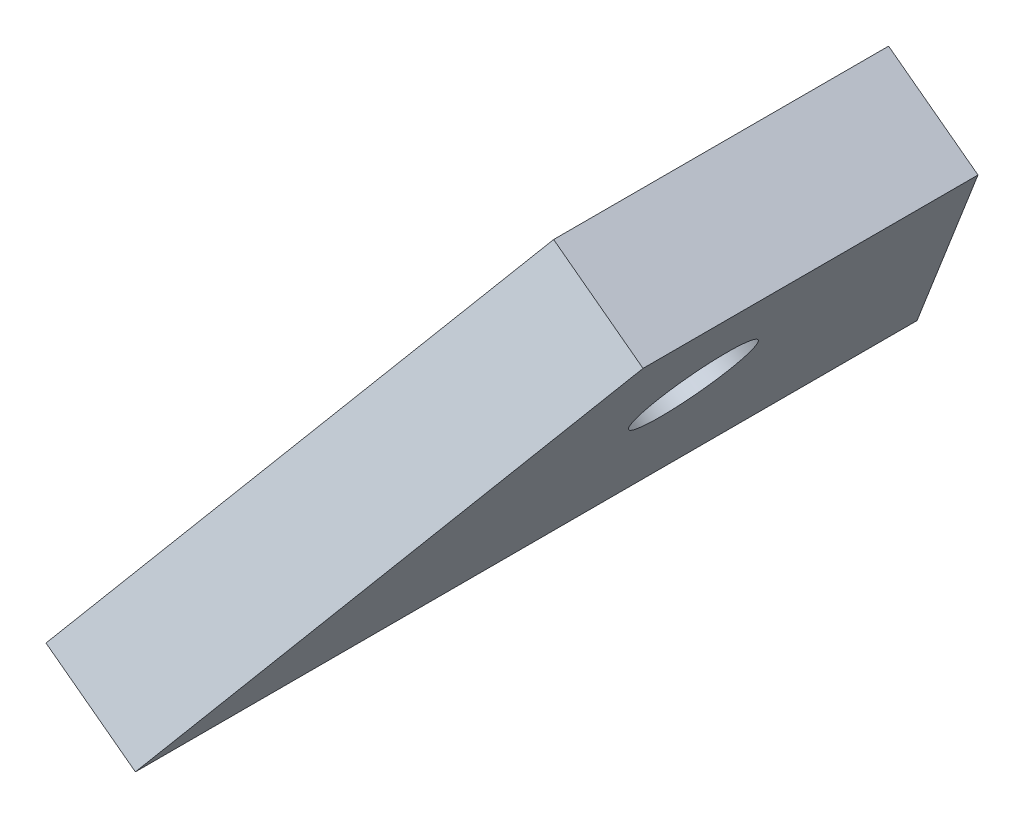
ISO-10303-21;
HEADER;
FILE_DESCRIPTION(('STEP AP214'),'2;1');
FILE_NAME('part.step','',(''),(''),'','','');
FILE_SCHEMA(('AUTOMOTIVE_DESIGN { 1 0 10303 214 1 1 1 1 }'));
ENDSEC;
DATA;
#1=APPLICATION_CONTEXT('core data for automotive mechanical design processes');
#2=APPLICATION_PROTOCOL_DEFINITION('international standard','automotive_design',2000,#1);
#3=PRODUCT_CONTEXT('',#1,'mechanical');
#4=PRODUCT('Part','Part','',(#3));
#5=PRODUCT_RELATED_PRODUCT_CATEGORY('part','',(#4));
#6=PRODUCT_DEFINITION_FORMATION('','',#4);
#7=PRODUCT_DEFINITION_CONTEXT('part definition',#1,'design');
#8=PRODUCT_DEFINITION('design','',#6,#7);
#9=PRODUCT_DEFINITION_SHAPE('','',#8);
#10=(LENGTH_UNIT() NAMED_UNIT(*) SI_UNIT(.MILLI.,.METRE.));
#11=(NAMED_UNIT(*) PLANE_ANGLE_UNIT() SI_UNIT($,.RADIAN.));
#12=(NAMED_UNIT(*) SI_UNIT($,.STERADIAN.) SOLID_ANGLE_UNIT());
#13=UNCERTAINTY_MEASURE_WITH_UNIT(LENGTH_MEASURE(1.E-05),#10,'distance_accuracy_value','');
#14=(GEOMETRIC_REPRESENTATION_CONTEXT(3) GLOBAL_UNCERTAINTY_ASSIGNED_CONTEXT((#13)) GLOBAL_UNIT_ASSIGNED_CONTEXT((#10,
#11,#12)) REPRESENTATION_CONTEXT('',''));
#15=CARTESIAN_POINT('',(0.,0.,0.));
#16=DIRECTION('',(0.,0.,1.));
#17=DIRECTION('',(1.,0.,0.));
#18=AXIS2_PLACEMENT_3D('',#15,#16,#17);
#19=CARTESIAN_POINT('',(-189.838837280634,417.784939326968,-6.));
#20=DIRECTION('',(-0.255106348102914,-0.340916217427251,0.904818702200994));
#21=DIRECTION('',(0.,-0.935780883525478,-0.35258210111728));
#22=AXIS2_PLACEMENT_3D('',#19,#20,#21);
#23=PLANE('',#22);
#24=DIRECTION('',(-0.542100989718691,-0.724446962032905,-0.425797036329881));
#25=VECTOR('',#24,1.);
#26=CARTESIAN_POINT('',(-186.636220180565,415.388432763166,-6.));
#27=LINE('',#26,#25);
#28=CARTESIAN_POINT('',(-186.636220180565,415.388432763166,-6.));
#29=VERTEX_POINT('',#28);
#30=CARTESIAN_POINT('',(-196.82137307672,401.777310087871,-14.));
#31=VERTEX_POINT('',#30);
#32=EDGE_CURVE('E106',#29,#31,#27,.T.);
#33=ORIENTED_EDGE('',*,*,#32,.T.);
#34=DIRECTION('',(0.800654275017383,-0.599126640950299,0.));
#35=VECTOR('',#34,1.);
#36=CARTESIAN_POINT('',(-200.02399017679,404.173816651672,-14.));
#37=LINE('',#36,#35);
#38=CARTESIAN_POINT('',(-200.02399017679,404.173816651672,-14.));
#39=VERTEX_POINT('',#38);
#40=EDGE_CURVE('E12',#39,#31,#37,.T.);
#41=ORIENTED_EDGE('',*,*,#40,.F.);
#42=DIRECTION('',(-0.542100989718691,-0.724446962032905,-0.425797036329881));
#43=VECTOR('',#42,1.);
#44=CARTESIAN_POINT('',(-189.838837280634,417.784939326968,-6.));
#45=LINE('',#44,#43);
#46=CARTESIAN_POINT('',(-189.838837280634,417.784939326968,-6.));
#47=VERTEX_POINT('',#46);
#48=EDGE_CURVE('E93',#47,#39,#45,.T.);
#49=ORIENTED_EDGE('',*,*,#48,.F.);
#50=DIRECTION('',(0.800654275017383,-0.599126640950299,0.));
#51=VECTOR('',#50,1.);
#52=CARTESIAN_POINT('',(-189.838837280634,417.784939326968,-6.));
#53=LINE('',#52,#51);
#54=EDGE_CURVE('E102',#47,#29,#53,.T.);
#55=ORIENTED_EDGE('',*,*,#54,.T.);
#56=EDGE_LOOP('',(#33,#41,#49,#55));
#57=FACE_BOUND('',#56,.T.);
#58=ADVANCED_FACE('F41',(#57),#23,.F.);
#59=CARTESIAN_POINT('',(-200.02399017679,404.173816651672,-14.));
#60=DIRECTION('',(0.599126640950299,0.800654275017383,0.));
#61=DIRECTION('',(-0.800654275017383,0.599126640950299,0.));
#62=AXIS2_PLACEMENT_3D('',#59,#60,#61);
#63=PLANE('',#62);
#64=DIRECTION('',(0.,0.,1.));
#65=VECTOR('',#64,1.);
#66=CARTESIAN_POINT('',(-196.82137307672,401.777310087871,-14.));
#67=LINE('',#66,#65);
#68=CARTESIAN_POINT('',(-196.82137307672,401.777310087871,14.));
#69=VERTEX_POINT('',#68);
#70=EDGE_CURVE('E97',#31,#69,#67,.T.);
#71=ORIENTED_EDGE('',*,*,#70,.T.);
#72=DIRECTION('',(0.800654275017383,-0.599126640950299,0.));
#73=VECTOR('',#72,1.);
#74=CARTESIAN_POINT('',(-200.02399017679,404.173816651672,14.));
#75=LINE('',#74,#73);
#76=CARTESIAN_POINT('',(-200.02399017679,404.173816651672,14.));
#77=VERTEX_POINT('',#76);
#78=EDGE_CURVE('E50',#77,#69,#75,.T.);
#79=ORIENTED_EDGE('',*,*,#78,.F.);
#80=DIRECTION('',(0.,0.,1.));
#81=VECTOR('',#80,1.);
#82=CARTESIAN_POINT('',(-200.02399017679,404.173816651672,-14.));
#83=LINE('',#82,#81);
#84=EDGE_CURVE('E88',#39,#77,#83,.T.);
#85=ORIENTED_EDGE('',*,*,#84,.F.);
#86=ORIENTED_EDGE('',*,*,#40,.T.);
#87=EDGE_LOOP('',(#71,#79,#85,#86));
#88=FACE_BOUND('',#87,.T.);
#89=ADVANCED_FACE('F96',(#88),#63,.F.);
#90=CARTESIAN_POINT('',(-200.02399017679,404.173816651672,14.));
#91=DIRECTION('',(-0.255106348102914,-0.340916217427251,-0.904818702200994));
#92=DIRECTION('',(0.,0.935780883525478,-0.35258210111728));
#93=AXIS2_PLACEMENT_3D('',#90,#91,#92);
#94=PLANE('',#93);
#95=DIRECTION('',(0.542100989718691,0.724446962032905,-0.425797036329881));
#96=VECTOR('',#95,1.);
#97=CARTESIAN_POINT('',(-196.82137307672,401.777310087871,14.));
#98=LINE('',#97,#96);
#99=CARTESIAN_POINT('',(-186.636220180565,415.388432763166,6.));
#100=VERTEX_POINT('',#99);
#101=EDGE_CURVE('E75',#69,#100,#98,.T.);
#102=ORIENTED_EDGE('',*,*,#101,.T.);
#103=DIRECTION('',(0.800654275017383,-0.599126640950299,0.));
#104=VECTOR('',#103,1.);
#105=CARTESIAN_POINT('',(-189.838837280634,417.784939326968,6.));
#106=LINE('',#105,#104);
#107=CARTESIAN_POINT('',(-189.838837280634,417.784939326968,6.));
#108=VERTEX_POINT('',#107);
#109=EDGE_CURVE('E98',#108,#100,#106,.T.);
#110=ORIENTED_EDGE('',*,*,#109,.F.);
#111=DIRECTION('',(0.542100989718691,0.724446962032905,-0.425797036329881));
#112=VECTOR('',#111,1.);
#113=CARTESIAN_POINT('',(-200.02399017679,404.173816651672,14.));
#114=LINE('',#113,#112);
#115=EDGE_CURVE('E91',#77,#108,#114,.T.);
#116=ORIENTED_EDGE('',*,*,#115,.F.);
#117=ORIENTED_EDGE('',*,*,#78,.T.);
#118=EDGE_LOOP('',(#102,#110,#116,#117));
#119=FACE_BOUND('',#118,.T.);
#120=ADVANCED_FACE('F100',(#119),#94,.F.);
#121=CARTESIAN_POINT('',(-189.838837280634,417.784939326968,6.));
#122=DIRECTION('',(-0.599126640950299,-0.800654275017383,0.));
#123=DIRECTION('',(0.800654275017383,-0.599126640950299,0.));
#124=AXIS2_PLACEMENT_3D('',#121,#122,#123);
#125=PLANE('',#124);
#126=DIRECTION('',(0.,0.,-1.));
#127=VECTOR('',#126,1.);
#128=CARTESIAN_POINT('',(-186.636220180565,415.388432763166,6.));
#129=LINE('',#128,#127);
#130=EDGE_CURVE('E81',#100,#29,#129,.T.);
#131=ORIENTED_EDGE('',*,*,#130,.T.);
#132=ORIENTED_EDGE('',*,*,#54,.F.);
#133=DIRECTION('',(0.,0.,-1.));
#134=VECTOR('',#133,1.);
#135=CARTESIAN_POINT('',(-189.838837280634,417.784939326968,6.));
#136=LINE('',#135,#134);
#137=EDGE_CURVE('E58',#108,#47,#136,.T.);
#138=ORIENTED_EDGE('',*,*,#137,.F.);
#139=ORIENTED_EDGE('',*,*,#109,.T.);
#140=EDGE_LOOP('',(#131,#132,#138,#139));
#141=FACE_BOUND('',#140,.T.);
#142=ADVANCED_FACE('F114',(#141),#125,.F.);
#143=CARTESIAN_POINT('',(-322.104306909234,241.029464846065,0.));
#144=DIRECTION('',(-0.800654275017382,0.5991266409503,0.));
#145=DIRECTION('',(-0.5991266409503,-0.800654275017382,0.));
#146=AXIS2_PLACEMENT_3D('',#143,#144,#145);
#147=PLANE('',#146);
#148=CARTESIAN_POINT('',(-194.032723767287,412.180359401846,0.));
#149=DIRECTION('',(-0.800654275017382,0.5991266409503,0.));
#150=DIRECTION('',(-0.5991266409503,-0.800654275017382,0.));
#151=AXIS2_PLACEMENT_3D('',#148,#149,#150);
#152=CIRCLE('',#151,2.);
#153=CARTESIAN_POINT('',(-195.230977049187,410.579050851811,0.));
#154=VERTEX_POINT('',#153);
#155=EDGE_CURVE('E109',#154,#154,#152,.T.);
#156=ORIENTED_EDGE('',*,*,#155,.F.);
#157=EDGE_LOOP('',(#156));
#158=FACE_BOUND('',#157,.T.);
#159=ORIENTED_EDGE('',*,*,#48,.T.);
#160=ORIENTED_EDGE('',*,*,#84,.T.);
#161=ORIENTED_EDGE('',*,*,#115,.T.);
#162=ORIENTED_EDGE('',*,*,#137,.T.);
#163=EDGE_LOOP('',(#159,#160,#161,#162));
#164=FACE_BOUND('',#163,.T.);
#165=ADVANCED_FACE('F89',(#158,#164),#147,.T.);
#166=CARTESIAN_POINT('',(-318.901689809164,238.632958282264,0.));
#167=DIRECTION('',(-0.800654275017382,0.5991266409503,0.));
#168=DIRECTION('',(-0.5991266409503,-0.800654275017382,0.));
#169=AXIS2_PLACEMENT_3D('',#166,#167,#168);
#170=PLANE('',#169);
#171=CARTESIAN_POINT('',(-190.830106667217,409.783852838045,0.));
#172=DIRECTION('',(-0.800654275017382,0.5991266409503,0.));
#173=DIRECTION('',(-0.5991266409503,-0.800654275017382,0.));
#174=AXIS2_PLACEMENT_3D('',#171,#172,#173);
#175=CIRCLE('',#174,2.);
#176=CARTESIAN_POINT('',(-192.028359949118,408.18254428801,0.));
#177=VERTEX_POINT('',#176);
#178=EDGE_CURVE('E44',#177,#177,#175,.T.);
#179=ORIENTED_EDGE('',*,*,#178,.T.);
#180=EDGE_LOOP('',(#179));
#181=FACE_BOUND('',#180,.T.);
#182=ORIENTED_EDGE('',*,*,#32,.F.);
#183=ORIENTED_EDGE('',*,*,#130,.F.);
#184=ORIENTED_EDGE('',*,*,#101,.F.);
#185=ORIENTED_EDGE('',*,*,#70,.F.);
#186=EDGE_LOOP('',(#182,#183,#184,#185));
#187=FACE_BOUND('',#186,.T.);
#188=ADVANCED_FACE('F117',(#181,#187),#170,.F.);
#189=CARTESIAN_POINT('',(-190.0294523922,409.184726197095,0.));
#190=DIRECTION('',(-0.800654275017385,0.599126640950297,0.));
#191=DIRECTION('',(-0.599126640950297,-0.800654275017385,0.));
#192=AXIS2_PLACEMENT_3D('',#189,#190,#191);
#193=CYLINDRICAL_SURFACE('',#192,2.);
#194=ORIENTED_EDGE('',*,*,#155,.T.);
#195=EDGE_LOOP('',(#194));
#196=FACE_BOUND('',#195,.T.);
#197=ORIENTED_EDGE('',*,*,#178,.F.);
#198=EDGE_LOOP('',(#197));
#199=FACE_BOUND('',#198,.T.);
#200=ADVANCED_FACE('F127',(#196,#199),#193,.F.);
#201=CLOSED_SHELL('',(#58,#89,#120,#142,#165,#188,#200));
#202=MANIFOLD_SOLID_BREP('B2',#201);
#203=ADVANCED_BREP_SHAPE_REPRESENTATION('',(#18,#202),#14);
#204=SHAPE_DEFINITION_REPRESENTATION(#9,#203);
ENDSEC;
END-ISO-10303-21;
